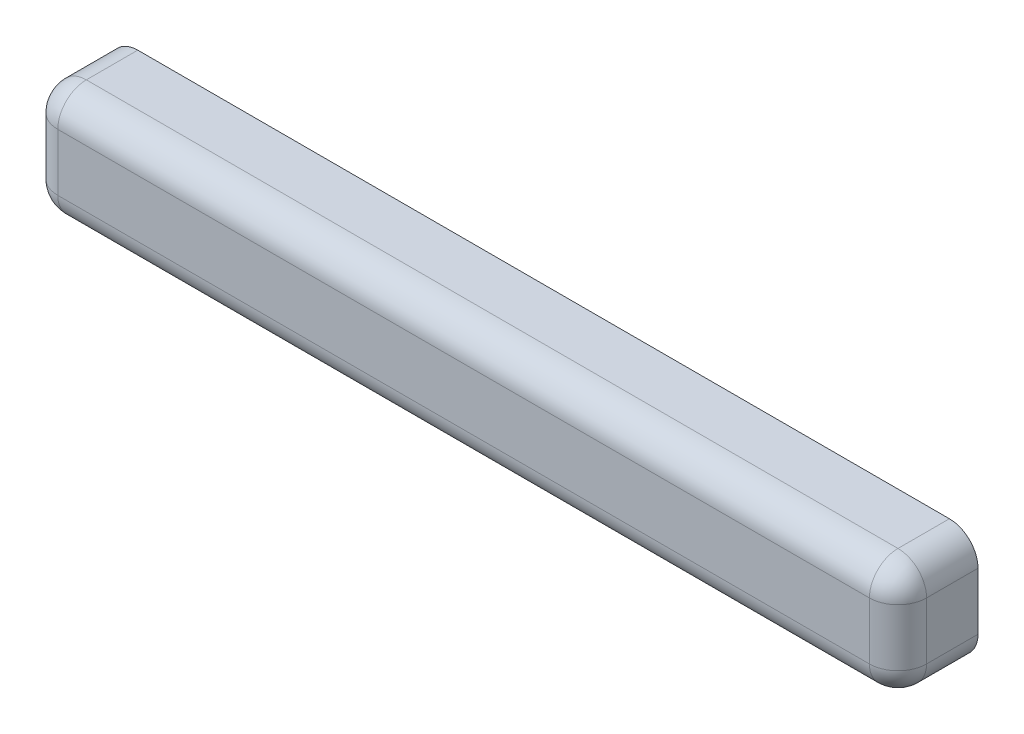
ISO-10303-21;
HEADER;
FILE_DESCRIPTION(('STEP AP214'),'2;1');
FILE_NAME('part.step','',(''),(''),'','','');
FILE_SCHEMA(('AUTOMOTIVE_DESIGN { 1 0 10303 214 1 1 1 1 }'));
ENDSEC;
DATA;
#1=APPLICATION_CONTEXT('core data for automotive mechanical design processes');
#2=APPLICATION_PROTOCOL_DEFINITION('international standard','automotive_design',2000,#1);
#3=PRODUCT_CONTEXT('',#1,'mechanical');
#4=PRODUCT('Part','Part','',(#3));
#5=PRODUCT_RELATED_PRODUCT_CATEGORY('part','',(#4));
#6=PRODUCT_DEFINITION_FORMATION('','',#4);
#7=PRODUCT_DEFINITION_CONTEXT('part definition',#1,'design');
#8=PRODUCT_DEFINITION('design','',#6,#7);
#9=PRODUCT_DEFINITION_SHAPE('','',#8);
#10=(LENGTH_UNIT() NAMED_UNIT(*) SI_UNIT(.MILLI.,.METRE.));
#11=(NAMED_UNIT(*) PLANE_ANGLE_UNIT() SI_UNIT($,.RADIAN.));
#12=(NAMED_UNIT(*) SI_UNIT($,.STERADIAN.) SOLID_ANGLE_UNIT());
#13=UNCERTAINTY_MEASURE_WITH_UNIT(LENGTH_MEASURE(1.E-05),#10,'distance_accuracy_value','');
#14=(GEOMETRIC_REPRESENTATION_CONTEXT(3) GLOBAL_UNCERTAINTY_ASSIGNED_CONTEXT((#13)) GLOBAL_UNIT_ASSIGNED_CONTEXT((#10,
#11,#12)) REPRESENTATION_CONTEXT('',''));
#15=CARTESIAN_POINT('',(0.,0.,0.));
#16=DIRECTION('',(0.,0.,1.));
#17=DIRECTION('',(1.,0.,0.));
#18=AXIS2_PLACEMENT_3D('',#15,#16,#17);
#19=CARTESIAN_POINT('',(482.6,63.5,44.45));
#20=DIRECTION('',(-1.,0.,0.));
#21=DIRECTION('',(0.,0.,1.));
#22=AXIS2_PLACEMENT_3D('',#19,#20,#21);
#23=PLANE('',#22);
#24=DIRECTION('',(0.,1.,0.));
#25=VECTOR('',#24,1.);
#26=CARTESIAN_POINT('',(482.6,-31.75,12.7));
#27=LINE('',#26,#25);
#28=CARTESIAN_POINT('',(482.6,31.75,12.7));
#29=VERTEX_POINT('',#28);
#30=CARTESIAN_POINT('',(482.6,-31.75,12.7));
#31=VERTEX_POINT('',#30);
#32=EDGE_CURVE('E175',#29,#31,#27,.F.);
#33=ORIENTED_EDGE('',*,*,#32,.T.);
#34=DIRECTION('',(0.,0.,-1.));
#35=VECTOR('',#34,1.);
#36=CARTESIAN_POINT('',(482.6,-31.75,44.45));
#37=LINE('',#36,#35);
#38=CARTESIAN_POINT('',(482.6,-31.75,-44.45));
#39=VERTEX_POINT('',#38);
#40=EDGE_CURVE('E177',#31,#39,#37,.T.);
#41=ORIENTED_EDGE('',*,*,#40,.T.);
#42=DIRECTION('',(0.,1.,0.));
#43=VECTOR('',#42,1.);
#44=CARTESIAN_POINT('',(482.6,63.5,-44.45));
#45=LINE('',#44,#43);
#46=CARTESIAN_POINT('',(482.6,31.75,-44.45));
#47=VERTEX_POINT('',#46);
#48=EDGE_CURVE('E173',#39,#47,#45,.T.);
#49=ORIENTED_EDGE('',*,*,#48,.T.);
#50=DIRECTION('',(0.,0.,-1.));
#51=VECTOR('',#50,1.);
#52=CARTESIAN_POINT('',(482.6,31.75,44.45));
#53=LINE('',#52,#51);
#54=EDGE_CURVE('E164',#47,#29,#53,.F.);
#55=ORIENTED_EDGE('',*,*,#54,.T.);
#56=EDGE_LOOP('',(#33,#41,#49,#55));
#57=FACE_BOUND('',#56,.T.);
#58=ADVANCED_FACE('F34',(#57),#23,.F.);
#59=CARTESIAN_POINT('',(-482.6,63.5,44.45));
#60=DIRECTION('',(0.,-1.,0.));
#61=DIRECTION('',(0.,0.,-1.));
#62=AXIS2_PLACEMENT_3D('',#59,#60,#61);
#63=PLANE('',#62);
#64=DIRECTION('',(-1.,0.,0.));
#65=VECTOR('',#64,1.);
#66=CARTESIAN_POINT('',(482.6,63.5,12.7));
#67=LINE('',#66,#65);
#68=CARTESIAN_POINT('',(-450.85,63.5,12.7));
#69=VERTEX_POINT('',#68);
#70=CARTESIAN_POINT('',(450.85,63.5,12.7));
#71=VERTEX_POINT('',#70);
#72=EDGE_CURVE('E124',#69,#71,#67,.F.);
#73=ORIENTED_EDGE('',*,*,#72,.T.);
#74=DIRECTION('',(0.,0.,-1.));
#75=VECTOR('',#74,1.);
#76=CARTESIAN_POINT('',(450.85,63.5,44.45));
#77=LINE('',#76,#75);
#78=CARTESIAN_POINT('',(450.85,63.5,-44.45));
#79=VERTEX_POINT('',#78);
#80=EDGE_CURVE('E11',#71,#79,#77,.T.);
#81=ORIENTED_EDGE('',*,*,#80,.T.);
#82=DIRECTION('',(-1.,0.,0.));
#83=VECTOR('',#82,1.);
#84=CARTESIAN_POINT('',(-482.6,63.5,-44.45));
#85=LINE('',#84,#83);
#86=CARTESIAN_POINT('',(-450.85,63.5,-44.45));
#87=VERTEX_POINT('',#86);
#88=EDGE_CURVE('E211',#79,#87,#85,.T.);
#89=ORIENTED_EDGE('',*,*,#88,.T.);
#90=DIRECTION('',(0.,0.,-1.));
#91=VECTOR('',#90,1.);
#92=CARTESIAN_POINT('',(-450.85,63.5,44.45));
#93=LINE('',#92,#91);
#94=EDGE_CURVE('E163',#87,#69,#93,.F.);
#95=ORIENTED_EDGE('',*,*,#94,.T.);
#96=EDGE_LOOP('',(#73,#81,#89,#95));
#97=FACE_BOUND('',#96,.T.);
#98=ADVANCED_FACE('F210',(#97),#63,.F.);
#99=CARTESIAN_POINT('',(-482.6,63.5,44.45));
#100=DIRECTION('',(1.,0.,0.));
#101=DIRECTION('',(0.,0.,-1.));
#102=AXIS2_PLACEMENT_3D('',#99,#100,#101);
#103=PLANE('',#102);
#104=DIRECTION('',(0.,-1.,0.));
#105=VECTOR('',#104,1.);
#106=CARTESIAN_POINT('',(-482.6,63.5,-44.45));
#107=LINE('',#106,#105);
#108=CARTESIAN_POINT('',(-482.6,31.75,-44.45));
#109=VERTEX_POINT('',#108);
#110=CARTESIAN_POINT('',(-482.6,-31.75,-44.45));
#111=VERTEX_POINT('',#110);
#112=EDGE_CURVE('E219',#109,#111,#107,.T.);
#113=ORIENTED_EDGE('',*,*,#112,.T.);
#114=DIRECTION('',(0.,0.,-1.));
#115=VECTOR('',#114,1.);
#116=CARTESIAN_POINT('',(-482.6,-31.75,44.45));
#117=LINE('',#116,#115);
#118=CARTESIAN_POINT('',(-482.6,-31.75,12.7));
#119=VERTEX_POINT('',#118);
#120=EDGE_CURVE('E136',#111,#119,#117,.F.);
#121=ORIENTED_EDGE('',*,*,#120,.T.);
#122=DIRECTION('',(0.,-1.,0.));
#123=VECTOR('',#122,1.);
#124=CARTESIAN_POINT('',(-482.6,31.75,12.7));
#125=LINE('',#124,#123);
#126=CARTESIAN_POINT('',(-482.6,31.75,12.7));
#127=VERTEX_POINT('',#126);
#128=EDGE_CURVE('E156',#119,#127,#125,.F.);
#129=ORIENTED_EDGE('',*,*,#128,.T.);
#130=DIRECTION('',(0.,0.,-1.));
#131=VECTOR('',#130,1.);
#132=CARTESIAN_POINT('',(-482.6,31.75,44.45));
#133=LINE('',#132,#131);
#134=EDGE_CURVE('E154',#127,#109,#133,.T.);
#135=ORIENTED_EDGE('',*,*,#134,.T.);
#136=EDGE_LOOP('',(#113,#121,#129,#135));
#137=FACE_BOUND('',#136,.T.);
#138=ADVANCED_FACE('F242',(#137),#103,.F.);
#139=CARTESIAN_POINT('',(-482.6,-63.5,44.45));
#140=DIRECTION('',(0.,1.,0.));
#141=DIRECTION('',(0.,0.,1.));
#142=AXIS2_PLACEMENT_3D('',#139,#140,#141);
#143=PLANE('',#142);
#144=DIRECTION('',(1.,0.,0.));
#145=VECTOR('',#144,1.);
#146=CARTESIAN_POINT('',(-482.6,-63.5,-44.45));
#147=LINE('',#146,#145);
#148=CARTESIAN_POINT('',(-450.85,-63.5,-44.45));
#149=VERTEX_POINT('',#148);
#150=CARTESIAN_POINT('',(450.85,-63.5,-44.45));
#151=VERTEX_POINT('',#150);
#152=EDGE_CURVE('E222',#149,#151,#147,.T.);
#153=ORIENTED_EDGE('',*,*,#152,.T.);
#154=DIRECTION('',(0.,0.,-1.));
#155=VECTOR('',#154,1.);
#156=CARTESIAN_POINT('',(450.85,-63.5,44.45));
#157=LINE('',#156,#155);
#158=CARTESIAN_POINT('',(450.85,-63.5,12.7));
#159=VERTEX_POINT('',#158);
#160=EDGE_CURVE('E121',#151,#159,#157,.F.);
#161=ORIENTED_EDGE('',*,*,#160,.T.);
#162=DIRECTION('',(1.,0.,0.));
#163=VECTOR('',#162,1.);
#164=CARTESIAN_POINT('',(-482.6,-63.5,12.7));
#165=LINE('',#164,#163);
#166=CARTESIAN_POINT('',(-450.85,-63.5,12.7));
#167=VERTEX_POINT('',#166);
#168=EDGE_CURVE('E113',#159,#167,#165,.F.);
#169=ORIENTED_EDGE('',*,*,#168,.T.);
#170=DIRECTION('',(0.,0.,-1.));
#171=VECTOR('',#170,1.);
#172=CARTESIAN_POINT('',(-450.85,-63.5,44.45));
#173=LINE('',#172,#171);
#174=EDGE_CURVE('E118',#167,#149,#173,.T.);
#175=ORIENTED_EDGE('',*,*,#174,.T.);
#176=EDGE_LOOP('',(#153,#161,#169,#175));
#177=FACE_BOUND('',#176,.T.);
#178=ADVANCED_FACE('F116',(#177),#143,.F.);
#179=CARTESIAN_POINT('',(0.,0.,44.45));
#180=DIRECTION('',(0.,0.,1.));
#181=DIRECTION('',(1.,0.,0.));
#182=AXIS2_PLACEMENT_3D('',#179,#180,#181);
#183=PLANE('',#182);
#184=DIRECTION('',(1.,0.,0.));
#185=VECTOR('',#184,1.);
#186=CARTESIAN_POINT('',(482.6,-31.75,44.45));
#187=LINE('',#186,#185);
#188=CARTESIAN_POINT('',(-450.85,-31.75,44.45));
#189=VERTEX_POINT('',#188);
#190=CARTESIAN_POINT('',(450.85,-31.75,44.45));
#191=VERTEX_POINT('',#190);
#192=EDGE_CURVE('E125',#189,#191,#187,.T.);
#193=ORIENTED_EDGE('',*,*,#192,.T.);
#194=DIRECTION('',(0.,1.,0.));
#195=VECTOR('',#194,1.);
#196=CARTESIAN_POINT('',(450.85,31.75,44.45));
#197=LINE('',#196,#195);
#198=CARTESIAN_POINT('',(450.85,31.75,44.45));
#199=VERTEX_POINT('',#198);
#200=EDGE_CURVE('E58',#191,#199,#197,.T.);
#201=ORIENTED_EDGE('',*,*,#200,.T.);
#202=DIRECTION('',(-1.,0.,0.));
#203=VECTOR('',#202,1.);
#204=CARTESIAN_POINT('',(-482.6,31.75,44.45));
#205=LINE('',#204,#203);
#206=CARTESIAN_POINT('',(-450.85,31.75,44.45));
#207=VERTEX_POINT('',#206);
#208=EDGE_CURVE('E228',#199,#207,#205,.T.);
#209=ORIENTED_EDGE('',*,*,#208,.T.);
#210=DIRECTION('',(0.,-1.,0.));
#211=VECTOR('',#210,1.);
#212=CARTESIAN_POINT('',(-450.85,-31.75,44.45));
#213=LINE('',#212,#211);
#214=EDGE_CURVE('E135',#207,#189,#213,.T.);
#215=ORIENTED_EDGE('',*,*,#214,.T.);
#216=EDGE_LOOP('',(#193,#201,#209,#215));
#217=FACE_BOUND('',#216,.T.);
#218=ADVANCED_FACE('F230',(#217),#183,.T.);
#219=CARTESIAN_POINT('',(0.,0.,-44.45));
#220=DIRECTION('',(0.,0.,1.));
#221=DIRECTION('',(1.,0.,0.));
#222=AXIS2_PLACEMENT_3D('',#219,#220,#221);
#223=PLANE('',#222);
#224=CARTESIAN_POINT('',(-271.716271795776,0.118953538077448,-44.45));
#225=DIRECTION('',(0.,0.,-1.));
#226=DIRECTION('',(1.,0.,0.));
#227=AXIS2_PLACEMENT_3D('',#224,#225,#226);
#228=CIRCLE('',#227,4.76250000000001);
#229=CARTESIAN_POINT('',(-266.953771795776,0.118953538077448,-44.45));
#230=VERTEX_POINT('',#229);
#231=EDGE_CURVE('E524',#230,#230,#228,.T.);
#232=ORIENTED_EDGE('',*,*,#231,.F.);
#233=EDGE_LOOP('',(#232));
#234=FACE_BOUND('',#233,.T.);
#235=CARTESIAN_POINT('',(-246.316271795776,0.118953538077449,-44.45));
#236=DIRECTION('',(0.,0.,-1.));
#237=DIRECTION('',(1.,0.,0.));
#238=AXIS2_PLACEMENT_3D('',#235,#236,#237);
#239=CIRCLE('',#238,4.76250000000001);
#240=CARTESIAN_POINT('',(-241.553771795776,0.118953538077449,-44.45));
#241=VERTEX_POINT('',#240);
#242=EDGE_CURVE('E523',#241,#241,#239,.T.);
#243=ORIENTED_EDGE('',*,*,#242,.F.);
#244=EDGE_LOOP('',(#243));
#245=FACE_BOUND('',#244,.T.);
#246=CARTESIAN_POINT('',(246.316271795776,0.118953538077449,-44.45));
#247=DIRECTION('',(0.,0.,-1.));
#248=DIRECTION('',(-1.,0.,0.));
#249=AXIS2_PLACEMENT_3D('',#246,#247,#248);
#250=CIRCLE('',#249,4.76250000000001);
#251=CARTESIAN_POINT('',(241.553771795776,0.118953538077449,-44.45));
#252=VERTEX_POINT('',#251);
#253=EDGE_CURVE('E533',#252,#252,#250,.T.);
#254=ORIENTED_EDGE('',*,*,#253,.F.);
#255=EDGE_LOOP('',(#254));
#256=FACE_BOUND('',#255,.T.);
#257=CARTESIAN_POINT('',(-13.7443883616523,0.,-44.45));
#258=DIRECTION('',(0.,0.,-1.));
#259=DIRECTION('',(-1.,0.,0.));
#260=AXIS2_PLACEMENT_3D('',#257,#258,#259);
#261=CIRCLE('',#260,4.7625);
#262=CARTESIAN_POINT('',(-18.5068883616523,0.,-44.45));
#263=VERTEX_POINT('',#262);
#264=EDGE_CURVE('E538',#263,#263,#261,.T.);
#265=ORIENTED_EDGE('',*,*,#264,.F.);
#266=EDGE_LOOP('',(#265));
#267=FACE_BOUND('',#266,.T.);
#268=CARTESIAN_POINT('',(271.716271795776,0.118953538077448,-44.45));
#269=DIRECTION('',(0.,0.,-1.));
#270=DIRECTION('',(-1.,0.,0.));
#271=AXIS2_PLACEMENT_3D('',#268,#269,#270);
#272=CIRCLE('',#271,4.76250000000001);
#273=CARTESIAN_POINT('',(266.953771795776,0.118953538077448,-44.45));
#274=VERTEX_POINT('',#273);
#275=EDGE_CURVE('E544',#274,#274,#272,.T.);
#276=ORIENTED_EDGE('',*,*,#275,.F.);
#277=EDGE_LOOP('',(#276));
#278=FACE_BOUND('',#277,.T.);
#279=CARTESIAN_POINT('',(11.6556116383477,0.,-44.45));
#280=DIRECTION('',(0.,0.,-1.));
#281=DIRECTION('',(-1.,0.,0.));
#282=AXIS2_PLACEMENT_3D('',#279,#280,#281);
#283=CIRCLE('',#282,4.7625);
#284=CARTESIAN_POINT('',(6.89311163834772,0.,-44.45));
#285=VERTEX_POINT('',#284);
#286=EDGE_CURVE('E550',#285,#285,#283,.T.);
#287=ORIENTED_EDGE('',*,*,#286,.F.);
#288=EDGE_LOOP('',(#287));
#289=FACE_BOUND('',#288,.T.);
#290=ORIENTED_EDGE('',*,*,#48,.F.);
#291=CARTESIAN_POINT('',(450.85,-31.75,-44.45));
#292=DIRECTION('',(0.,0.,1.));
#293=DIRECTION('',(1.,0.,0.));
#294=AXIS2_PLACEMENT_3D('',#291,#292,#293);
#295=CIRCLE('',#294,31.75);
#296=EDGE_CURVE('E182',#39,#151,#295,.F.);
#297=ORIENTED_EDGE('',*,*,#296,.T.);
#298=ORIENTED_EDGE('',*,*,#152,.F.);
#299=CARTESIAN_POINT('',(-450.85,-31.75,-44.45));
#300=DIRECTION('',(0.,0.,1.));
#301=DIRECTION('',(1.,0.,0.));
#302=AXIS2_PLACEMENT_3D('',#299,#300,#301);
#303=CIRCLE('',#302,31.75);
#304=EDGE_CURVE('E146',#149,#111,#303,.F.);
#305=ORIENTED_EDGE('',*,*,#304,.T.);
#306=ORIENTED_EDGE('',*,*,#112,.F.);
#307=CARTESIAN_POINT('',(-450.85,31.75,-44.45));
#308=DIRECTION('',(0.,0.,1.));
#309=DIRECTION('',(1.,0.,0.));
#310=AXIS2_PLACEMENT_3D('',#307,#308,#309);
#311=CIRCLE('',#310,31.75);
#312=EDGE_CURVE('E147',#109,#87,#311,.F.);
#313=ORIENTED_EDGE('',*,*,#312,.T.);
#314=ORIENTED_EDGE('',*,*,#88,.F.);
#315=CARTESIAN_POINT('',(450.85,31.75,-44.45));
#316=DIRECTION('',(0.,0.,1.));
#317=DIRECTION('',(1.,0.,0.));
#318=AXIS2_PLACEMENT_3D('',#315,#316,#317);
#319=CIRCLE('',#318,31.75);
#320=EDGE_CURVE('E180',#79,#47,#319,.F.);
#321=ORIENTED_EDGE('',*,*,#320,.T.);
#322=EDGE_LOOP('',(#290,#297,#298,#305,#306,#313,#314,#321));
#323=FACE_BOUND('',#322,.T.);
#324=ADVANCED_FACE('F214',(#234,#245,#256,#267,#278,#289,#323),#223,.F.);
#325=CARTESIAN_POINT('',(0.,-31.75,12.7));
#326=DIRECTION('',(-1.,0.,0.));
#327=DIRECTION('',(0.,0.,1.));
#328=AXIS2_PLACEMENT_3D('',#325,#326,#327);
#329=CYLINDRICAL_SURFACE('',#328,31.75);
#330=ORIENTED_EDGE('',*,*,#168,.F.);
#331=CARTESIAN_POINT('',(450.85,-31.75,12.7));
#332=DIRECTION('',(-1.,0.,0.));
#333=DIRECTION('',(0.,0.,1.));
#334=AXIS2_PLACEMENT_3D('',#331,#332,#333);
#335=CIRCLE('',#334,31.75);
#336=EDGE_CURVE('E185',#159,#191,#335,.T.);
#337=ORIENTED_EDGE('',*,*,#336,.T.);
#338=ORIENTED_EDGE('',*,*,#192,.F.);
#339=CARTESIAN_POINT('',(-450.85,-31.75,12.7));
#340=DIRECTION('',(-1.,0.,0.));
#341=DIRECTION('',(0.,0.,1.));
#342=AXIS2_PLACEMENT_3D('',#339,#340,#341);
#343=CIRCLE('',#342,31.75);
#344=EDGE_CURVE('E129',#189,#167,#343,.F.);
#345=ORIENTED_EDGE('',*,*,#344,.T.);
#346=EDGE_LOOP('',(#330,#337,#338,#345));
#347=FACE_BOUND('',#346,.T.);
#348=ADVANCED_FACE('F131',(#347),#329,.T.);
#349=CARTESIAN_POINT('',(0.,31.75,12.7));
#350=DIRECTION('',(1.,0.,0.));
#351=DIRECTION('',(0.,0.,-1.));
#352=AXIS2_PLACEMENT_3D('',#349,#350,#351);
#353=CYLINDRICAL_SURFACE('',#352,31.75);
#354=ORIENTED_EDGE('',*,*,#208,.F.);
#355=CARTESIAN_POINT('',(450.85,31.75,12.7));
#356=DIRECTION('',(1.,0.,0.));
#357=DIRECTION('',(0.,0.,-1.));
#358=AXIS2_PLACEMENT_3D('',#355,#356,#357);
#359=CIRCLE('',#358,31.75);
#360=EDGE_CURVE('E43',#199,#71,#359,.F.);
#361=ORIENTED_EDGE('',*,*,#360,.T.);
#362=ORIENTED_EDGE('',*,*,#72,.F.);
#363=CARTESIAN_POINT('',(-450.85,31.75,12.7));
#364=DIRECTION('',(1.,0.,0.));
#365=DIRECTION('',(0.,0.,-1.));
#366=AXIS2_PLACEMENT_3D('',#363,#364,#365);
#367=CIRCLE('',#366,31.75);
#368=EDGE_CURVE('E160',#69,#207,#367,.T.);
#369=ORIENTED_EDGE('',*,*,#368,.T.);
#370=EDGE_LOOP('',(#354,#361,#362,#369));
#371=FACE_BOUND('',#370,.T.);
#372=ADVANCED_FACE('F272',(#371),#353,.T.);
#373=CARTESIAN_POINT('',(-450.85,31.75,44.45));
#374=DIRECTION('',(0.,0.,-1.));
#375=DIRECTION('',(-1.,0.,0.));
#376=AXIS2_PLACEMENT_3D('',#373,#374,#375);
#377=CYLINDRICAL_SURFACE('',#376,31.75);
#378=CARTESIAN_POINT('',(-450.85,31.75,12.7));
#379=DIRECTION('',(0.,0.,1.));
#380=DIRECTION('',(1.,0.,0.));
#381=AXIS2_PLACEMENT_3D('',#378,#379,#380);
#382=CIRCLE('',#381,31.75);
#383=EDGE_CURVE('E170',#69,#127,#382,.T.);
#384=ORIENTED_EDGE('',*,*,#383,.F.);
#385=ORIENTED_EDGE('',*,*,#94,.F.);
#386=ORIENTED_EDGE('',*,*,#312,.F.);
#387=ORIENTED_EDGE('',*,*,#134,.F.);
#388=EDGE_LOOP('',(#384,#385,#386,#387));
#389=FACE_BOUND('',#388,.T.);
#390=ADVANCED_FACE('F247',(#389),#377,.T.);
#391=CARTESIAN_POINT('',(-450.85,31.75,12.7));
#392=DIRECTION('',(1.,0.,0.));
#393=DIRECTION('',(0.,0.,-1.));
#394=AXIS2_PLACEMENT_3D('',#391,#392,#393);
#395=SPHERICAL_SURFACE('',#394,31.75);
#396=ORIENTED_EDGE('',*,*,#368,.F.);
#397=ORIENTED_EDGE('',*,*,#383,.T.);
#398=CARTESIAN_POINT('',(-450.85,31.75,12.7));
#399=DIRECTION('',(0.,-1.,0.));
#400=DIRECTION('',(0.,0.,-1.));
#401=AXIS2_PLACEMENT_3D('',#398,#399,#400);
#402=CIRCLE('',#401,31.75);
#403=EDGE_CURVE('E167',#207,#127,#402,.T.);
#404=ORIENTED_EDGE('',*,*,#403,.F.);
#405=EDGE_LOOP('',(#396,#397,#404));
#406=FACE_BOUND('',#405,.T.);
#407=ADVANCED_FACE('F251',(#406),#395,.T.);
#408=CARTESIAN_POINT('',(-450.85,0.,12.7));
#409=DIRECTION('',(0.,1.,0.));
#410=DIRECTION('',(0.,0.,1.));
#411=AXIS2_PLACEMENT_3D('',#408,#409,#410);
#412=CYLINDRICAL_SURFACE('',#411,31.75);
#413=CARTESIAN_POINT('',(-450.85,-31.75,12.7));
#414=DIRECTION('',(0.,-1.,0.));
#415=DIRECTION('',(0.,0.,-1.));
#416=AXIS2_PLACEMENT_3D('',#413,#414,#415);
#417=CIRCLE('',#416,31.75);
#418=EDGE_CURVE('E141',#189,#119,#417,.T.);
#419=ORIENTED_EDGE('',*,*,#418,.F.);
#420=ORIENTED_EDGE('',*,*,#214,.F.);
#421=ORIENTED_EDGE('',*,*,#403,.T.);
#422=ORIENTED_EDGE('',*,*,#128,.F.);
#423=EDGE_LOOP('',(#419,#420,#421,#422));
#424=FACE_BOUND('',#423,.T.);
#425=ADVANCED_FACE('F253',(#424),#412,.T.);
#426=CARTESIAN_POINT('',(-450.85,-31.75,12.7));
#427=DIRECTION('',(1.,0.,0.));
#428=DIRECTION('',(0.,0.,-1.));
#429=AXIS2_PLACEMENT_3D('',#426,#427,#428);
#430=SPHERICAL_SURFACE('',#429,31.75);
#431=ORIENTED_EDGE('',*,*,#344,.F.);
#432=ORIENTED_EDGE('',*,*,#418,.T.);
#433=CARTESIAN_POINT('',(-450.85,-31.75,12.7));
#434=DIRECTION('',(0.,0.,-1.));
#435=DIRECTION('',(-1.,0.,0.));
#436=AXIS2_PLACEMENT_3D('',#433,#434,#435);
#437=CIRCLE('',#436,31.75);
#438=EDGE_CURVE('E139',#167,#119,#437,.T.);
#439=ORIENTED_EDGE('',*,*,#438,.F.);
#440=EDGE_LOOP('',(#431,#432,#439));
#441=FACE_BOUND('',#440,.T.);
#442=ADVANCED_FACE('F140',(#441),#430,.T.);
#443=CARTESIAN_POINT('',(-450.85,-31.75,44.45));
#444=DIRECTION('',(0.,0.,-1.));
#445=DIRECTION('',(-1.,0.,0.));
#446=AXIS2_PLACEMENT_3D('',#443,#444,#445);
#447=CYLINDRICAL_SURFACE('',#446,31.75);
#448=ORIENTED_EDGE('',*,*,#438,.T.);
#449=ORIENTED_EDGE('',*,*,#120,.F.);
#450=ORIENTED_EDGE('',*,*,#304,.F.);
#451=ORIENTED_EDGE('',*,*,#174,.F.);
#452=EDGE_LOOP('',(#448,#449,#450,#451));
#453=FACE_BOUND('',#452,.T.);
#454=ADVANCED_FACE('F145',(#453),#447,.T.);
#455=CARTESIAN_POINT('',(450.85,31.75,44.45));
#456=DIRECTION('',(0.,0.,-1.));
#457=DIRECTION('',(-1.,0.,0.));
#458=AXIS2_PLACEMENT_3D('',#455,#456,#457);
#459=CYLINDRICAL_SURFACE('',#458,31.75);
#460=ORIENTED_EDGE('',*,*,#320,.F.);
#461=ORIENTED_EDGE('',*,*,#80,.F.);
#462=CARTESIAN_POINT('',(450.85,31.75,12.7));
#463=DIRECTION('',(0.,0.,1.));
#464=DIRECTION('',(1.,0.,0.));
#465=AXIS2_PLACEMENT_3D('',#462,#463,#464);
#466=CIRCLE('',#465,31.75);
#467=EDGE_CURVE('E38',#29,#71,#466,.T.);
#468=ORIENTED_EDGE('',*,*,#467,.F.);
#469=ORIENTED_EDGE('',*,*,#54,.F.);
#470=EDGE_LOOP('',(#460,#461,#468,#469));
#471=FACE_BOUND('',#470,.T.);
#472=ADVANCED_FACE('F36',(#471),#459,.T.);
#473=CARTESIAN_POINT('',(450.85,31.75,12.7));
#474=DIRECTION('',(-1.,0.,0.));
#475=DIRECTION('',(0.,0.,1.));
#476=AXIS2_PLACEMENT_3D('',#473,#474,#475);
#477=SPHERICAL_SURFACE('',#476,31.75);
#478=ORIENTED_EDGE('',*,*,#467,.T.);
#479=ORIENTED_EDGE('',*,*,#360,.F.);
#480=CARTESIAN_POINT('',(450.85,31.75,12.7));
#481=DIRECTION('',(0.,-1.,0.));
#482=DIRECTION('',(0.,0.,-1.));
#483=AXIS2_PLACEMENT_3D('',#480,#481,#482);
#484=CIRCLE('',#483,31.75);
#485=EDGE_CURVE('E195',#29,#199,#484,.T.);
#486=ORIENTED_EDGE('',*,*,#485,.F.);
#487=EDGE_LOOP('',(#478,#479,#486));
#488=FACE_BOUND('',#487,.T.);
#489=ADVANCED_FACE('F203',(#488),#477,.T.);
#490=CARTESIAN_POINT('',(450.85,0.,12.7));
#491=DIRECTION('',(0.,-1.,0.));
#492=DIRECTION('',(0.,0.,-1.));
#493=AXIS2_PLACEMENT_3D('',#490,#491,#492);
#494=CYLINDRICAL_SURFACE('',#493,31.75);
#495=ORIENTED_EDGE('',*,*,#485,.T.);
#496=ORIENTED_EDGE('',*,*,#200,.F.);
#497=CARTESIAN_POINT('',(450.85,-31.75,12.7));
#498=DIRECTION('',(0.,-1.,0.));
#499=DIRECTION('',(0.,0.,-1.));
#500=AXIS2_PLACEMENT_3D('',#497,#498,#499);
#501=CIRCLE('',#500,31.75);
#502=EDGE_CURVE('E192',#31,#191,#501,.T.);
#503=ORIENTED_EDGE('',*,*,#502,.F.);
#504=ORIENTED_EDGE('',*,*,#32,.F.);
#505=EDGE_LOOP('',(#495,#496,#503,#504));
#506=FACE_BOUND('',#505,.T.);
#507=ADVANCED_FACE('F233',(#506),#494,.T.);
#508=CARTESIAN_POINT('',(450.85,-31.75,12.7));
#509=DIRECTION('',(-1.,0.,0.));
#510=DIRECTION('',(0.,0.,1.));
#511=AXIS2_PLACEMENT_3D('',#508,#509,#510);
#512=SPHERICAL_SURFACE('',#511,31.75);
#513=ORIENTED_EDGE('',*,*,#502,.T.);
#514=ORIENTED_EDGE('',*,*,#336,.F.);
#515=CARTESIAN_POINT('',(450.85,-31.75,12.7));
#516=DIRECTION('',(0.,0.,-1.));
#517=DIRECTION('',(-1.,0.,0.));
#518=AXIS2_PLACEMENT_3D('',#515,#516,#517);
#519=CIRCLE('',#518,31.75);
#520=EDGE_CURVE('E189',#31,#159,#519,.T.);
#521=ORIENTED_EDGE('',*,*,#520,.F.);
#522=EDGE_LOOP('',(#513,#514,#521));
#523=FACE_BOUND('',#522,.T.);
#524=ADVANCED_FACE('F236',(#523),#512,.T.);
#525=CARTESIAN_POINT('',(450.85,-31.75,44.45));
#526=DIRECTION('',(0.,0.,-1.));
#527=DIRECTION('',(-1.,0.,0.));
#528=AXIS2_PLACEMENT_3D('',#525,#526,#527);
#529=CYLINDRICAL_SURFACE('',#528,31.75);
#530=ORIENTED_EDGE('',*,*,#520,.T.);
#531=ORIENTED_EDGE('',*,*,#160,.F.);
#532=ORIENTED_EDGE('',*,*,#296,.F.);
#533=ORIENTED_EDGE('',*,*,#40,.F.);
#534=EDGE_LOOP('',(#530,#531,#532,#533));
#535=FACE_BOUND('',#534,.T.);
#536=ADVANCED_FACE('F239',(#535),#529,.T.);
#537=CARTESIAN_POINT('',(11.6556116383477,0.,-19.05));
#538=DIRECTION('',(0.,0.,-1.));
#539=DIRECTION('',(-1.,0.,0.));
#540=AXIS2_PLACEMENT_3D('',#537,#538,#539);
#541=CYLINDRICAL_SURFACE('',#540,4.7625);
#542=CARTESIAN_POINT('',(11.6556116383477,0.,-19.05));
#543=DIRECTION('',(0.,0.,-1.));
#544=DIRECTION('',(-1.,0.,0.));
#545=AXIS2_PLACEMENT_3D('',#542,#543,#544);
#546=CIRCLE('',#545,4.7625);
#547=CARTESIAN_POINT('',(6.89311163834772,0.,-19.05));
#548=VERTEX_POINT('',#547);
#549=EDGE_CURVE('E193',#548,#548,#546,.T.);
#550=ORIENTED_EDGE('',*,*,#549,.F.);
#551=EDGE_LOOP('',(#550));
#552=FACE_BOUND('',#551,.T.);
#553=ORIENTED_EDGE('',*,*,#286,.T.);
#554=EDGE_LOOP('',(#553));
#555=FACE_BOUND('',#554,.T.);
#556=ADVANCED_FACE('F291',(#552,#555),#541,.F.);
#557=CARTESIAN_POINT('',(11.6556116383477,0.,-19.05));
#558=DIRECTION('',(0.,0.,-1.));
#559=DIRECTION('',(-1.,0.,0.));
#560=AXIS2_PLACEMENT_3D('',#557,#558,#559);
#561=PLANE('',#560);
#562=ORIENTED_EDGE('',*,*,#549,.T.);
#563=EDGE_LOOP('',(#562));
#564=FACE_BOUND('',#563,.T.);
#565=ADVANCED_FACE('F402',(#564),#561,.T.);
#566=CARTESIAN_POINT('',(271.716271795776,0.118953538077448,-19.05));
#567=DIRECTION('',(0.,0.,-1.));
#568=DIRECTION('',(-1.,0.,0.));
#569=AXIS2_PLACEMENT_3D('',#566,#567,#568);
#570=CYLINDRICAL_SURFACE('',#569,4.76250000000001);
#571=CARTESIAN_POINT('',(271.716271795776,0.118953538077448,-19.05));
#572=DIRECTION('',(0.,0.,-1.));
#573=DIRECTION('',(-1.,0.,0.));
#574=AXIS2_PLACEMENT_3D('',#571,#572,#573);
#575=CIRCLE('',#574,4.76250000000001);
#576=CARTESIAN_POINT('',(266.953771795776,0.118953538077448,-19.05));
#577=VERTEX_POINT('',#576);
#578=EDGE_CURVE('E547',#577,#577,#575,.T.);
#579=ORIENTED_EDGE('',*,*,#578,.F.);
#580=EDGE_LOOP('',(#579));
#581=FACE_BOUND('',#580,.T.);
#582=ORIENTED_EDGE('',*,*,#275,.T.);
#583=EDGE_LOOP('',(#582));
#584=FACE_BOUND('',#583,.T.);
#585=ADVANCED_FACE('F412',(#581,#584),#570,.F.);
#586=CARTESIAN_POINT('',(271.716271795776,0.118953538077448,-19.05));
#587=DIRECTION('',(0.,0.,-1.));
#588=DIRECTION('',(-1.,0.,0.));
#589=AXIS2_PLACEMENT_3D('',#586,#587,#588);
#590=PLANE('',#589);
#591=ORIENTED_EDGE('',*,*,#578,.T.);
#592=EDGE_LOOP('',(#591));
#593=FACE_BOUND('',#592,.T.);
#594=ADVANCED_FACE('F422',(#593),#590,.T.);
#595=CARTESIAN_POINT('',(-13.7443883616523,0.,-19.05));
#596=DIRECTION('',(0.,0.,-1.));
#597=DIRECTION('',(-1.,0.,0.));
#598=AXIS2_PLACEMENT_3D('',#595,#596,#597);
#599=CYLINDRICAL_SURFACE('',#598,4.7625);
#600=CARTESIAN_POINT('',(-13.7443883616523,0.,-19.05));
#601=DIRECTION('',(0.,0.,-1.));
#602=DIRECTION('',(-1.,0.,0.));
#603=AXIS2_PLACEMENT_3D('',#600,#601,#602);
#604=CIRCLE('',#603,4.7625);
#605=CARTESIAN_POINT('',(-18.5068883616523,0.,-19.05));
#606=VERTEX_POINT('',#605);
#607=EDGE_CURVE('E541',#606,#606,#604,.T.);
#608=ORIENTED_EDGE('',*,*,#607,.F.);
#609=EDGE_LOOP('',(#608));
#610=FACE_BOUND('',#609,.T.);
#611=ORIENTED_EDGE('',*,*,#264,.T.);
#612=EDGE_LOOP('',(#611));
#613=FACE_BOUND('',#612,.T.);
#614=ADVANCED_FACE('F432',(#610,#613),#599,.F.);
#615=CARTESIAN_POINT('',(-13.7443883616523,0.,-19.05));
#616=DIRECTION('',(0.,0.,-1.));
#617=DIRECTION('',(-1.,0.,0.));
#618=AXIS2_PLACEMENT_3D('',#615,#616,#617);
#619=PLANE('',#618);
#620=ORIENTED_EDGE('',*,*,#607,.T.);
#621=EDGE_LOOP('',(#620));
#622=FACE_BOUND('',#621,.T.);
#623=ADVANCED_FACE('F442',(#622),#619,.T.);
#624=CARTESIAN_POINT('',(246.316271795776,0.118953538077449,-19.05));
#625=DIRECTION('',(0.,0.,-1.));
#626=DIRECTION('',(-1.,0.,0.));
#627=AXIS2_PLACEMENT_3D('',#624,#625,#626);
#628=CYLINDRICAL_SURFACE('',#627,4.76250000000001);
#629=CARTESIAN_POINT('',(246.316271795776,0.118953538077449,-19.05));
#630=DIRECTION('',(0.,0.,-1.));
#631=DIRECTION('',(-1.,0.,0.));
#632=AXIS2_PLACEMENT_3D('',#629,#630,#631);
#633=CIRCLE('',#632,4.76250000000001);
#634=CARTESIAN_POINT('',(241.553771795776,0.118953538077449,-19.05));
#635=VERTEX_POINT('',#634);
#636=EDGE_CURVE('E535',#635,#635,#633,.T.);
#637=ORIENTED_EDGE('',*,*,#636,.F.);
#638=EDGE_LOOP('',(#637));
#639=FACE_BOUND('',#638,.T.);
#640=ORIENTED_EDGE('',*,*,#253,.T.);
#641=EDGE_LOOP('',(#640));
#642=FACE_BOUND('',#641,.T.);
#643=ADVANCED_FACE('F452',(#639,#642),#628,.F.);
#644=CARTESIAN_POINT('',(246.316271795776,0.118953538077449,-19.05));
#645=DIRECTION('',(0.,0.,-1.));
#646=DIRECTION('',(-1.,0.,0.));
#647=AXIS2_PLACEMENT_3D('',#644,#645,#646);
#648=PLANE('',#647);
#649=ORIENTED_EDGE('',*,*,#636,.T.);
#650=EDGE_LOOP('',(#649));
#651=FACE_BOUND('',#650,.T.);
#652=ADVANCED_FACE('F462',(#651),#648,.T.);
#653=CARTESIAN_POINT('',(-246.316271795776,0.118953538077449,-19.05));
#654=DIRECTION('',(0.,0.,-1.));
#655=DIRECTION('',(-1.,0.,0.));
#656=AXIS2_PLACEMENT_3D('',#653,#654,#655);
#657=CYLINDRICAL_SURFACE('',#656,4.76250000000001);
#658=CARTESIAN_POINT('',(-246.316271795776,0.118953538077449,-19.05));
#659=DIRECTION('',(0.,0.,-1.));
#660=DIRECTION('',(1.,0.,0.));
#661=AXIS2_PLACEMENT_3D('',#658,#659,#660);
#662=CIRCLE('',#661,4.76250000000001);
#663=CARTESIAN_POINT('',(-241.553771795776,0.118953538077449,-19.05));
#664=VERTEX_POINT('',#663);
#665=EDGE_CURVE('E527',#664,#664,#662,.T.);
#666=ORIENTED_EDGE('',*,*,#665,.F.);
#667=EDGE_LOOP('',(#666));
#668=FACE_BOUND('',#667,.T.);
#669=ORIENTED_EDGE('',*,*,#242,.T.);
#670=EDGE_LOOP('',(#669));
#671=FACE_BOUND('',#670,.T.);
#672=ADVANCED_FACE('F472',(#668,#671),#657,.F.);
#673=CARTESIAN_POINT('',(-246.316271795776,0.118953538077449,-19.05));
#674=DIRECTION('',(0.,0.,1.));
#675=DIRECTION('',(1.,0.,0.));
#676=AXIS2_PLACEMENT_3D('',#673,#674,#675);
#677=PLANE('',#676);
#678=ORIENTED_EDGE('',*,*,#665,.T.);
#679=EDGE_LOOP('',(#678));
#680=FACE_BOUND('',#679,.T.);
#681=ADVANCED_FACE('F482',(#680),#677,.F.);
#682=CARTESIAN_POINT('',(-271.716271795776,0.118953538077448,-19.05));
#683=DIRECTION('',(0.,0.,-1.));
#684=DIRECTION('',(-1.,0.,0.));
#685=AXIS2_PLACEMENT_3D('',#682,#683,#684);
#686=CYLINDRICAL_SURFACE('',#685,4.76250000000001);
#687=CARTESIAN_POINT('',(-271.716271795776,0.118953538077448,-19.05));
#688=DIRECTION('',(0.,0.,-1.));
#689=DIRECTION('',(1.,0.,0.));
#690=AXIS2_PLACEMENT_3D('',#687,#688,#689);
#691=CIRCLE('',#690,4.76250000000001);
#692=CARTESIAN_POINT('',(-266.953771795776,0.118953538077448,-19.05));
#693=VERTEX_POINT('',#692);
#694=EDGE_CURVE('E522',#693,#693,#691,.T.);
#695=ORIENTED_EDGE('',*,*,#694,.F.);
#696=EDGE_LOOP('',(#695));
#697=FACE_BOUND('',#696,.T.);
#698=ORIENTED_EDGE('',*,*,#231,.T.);
#699=EDGE_LOOP('',(#698));
#700=FACE_BOUND('',#699,.T.);
#701=ADVANCED_FACE('F492',(#697,#700),#686,.F.);
#702=CARTESIAN_POINT('',(-271.716271795776,0.118953538077448,-19.05));
#703=DIRECTION('',(0.,0.,1.));
#704=DIRECTION('',(1.,0.,0.));
#705=AXIS2_PLACEMENT_3D('',#702,#703,#704);
#706=PLANE('',#705);
#707=ORIENTED_EDGE('',*,*,#694,.T.);
#708=EDGE_LOOP('',(#707));
#709=FACE_BOUND('',#708,.T.);
#710=ADVANCED_FACE('F502',(#709),#706,.F.);
#711=CLOSED_SHELL('',(#58,#98,#138,#178,#218,#324,#348,#372,#390,#407,#425,#442,#454,#472,#489,
#507,#524,#536,#556,#565,#585,#594,#614,#623,#643,#652,#672,#681,#701,#710));
#712=MANIFOLD_SOLID_BREP('B2',#711);
#713=ADVANCED_BREP_SHAPE_REPRESENTATION('',(#18,#712),#14);
#714=SHAPE_DEFINITION_REPRESENTATION(#9,#713);
ENDSEC;
END-ISO-10303-21;
